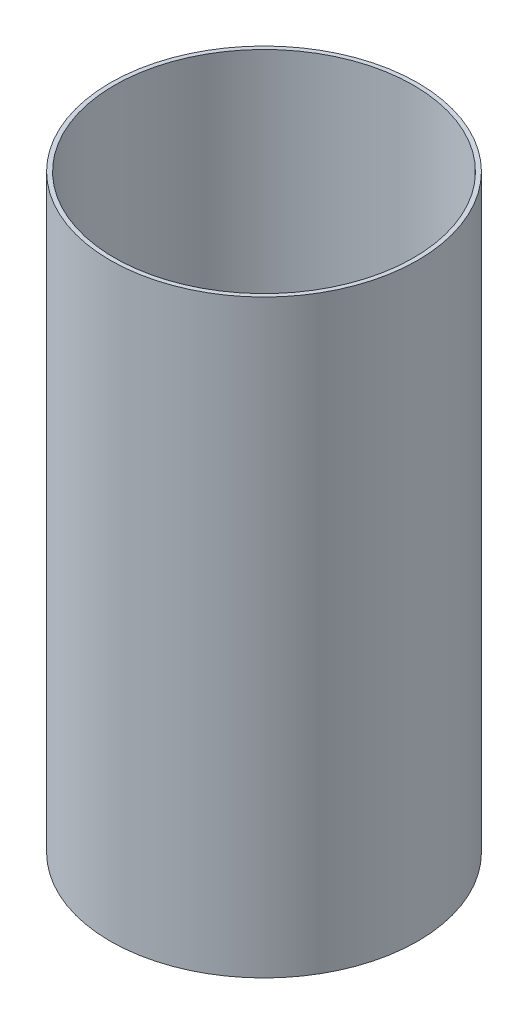
ISO-10303-21;
HEADER;
FILE_DESCRIPTION(('STEP AP214'),'2;1');
FILE_NAME('part.step','',(''),(''),'','','');
FILE_SCHEMA(('AUTOMOTIVE_DESIGN { 1 0 10303 214 1 1 1 1 }'));
ENDSEC;
DATA;
#1=APPLICATION_CONTEXT('core data for automotive mechanical design processes');
#2=APPLICATION_PROTOCOL_DEFINITION('international standard','automotive_design',2000,#1);
#3=PRODUCT_CONTEXT('',#1,'mechanical');
#4=PRODUCT('Part','Part','',(#3));
#5=PRODUCT_RELATED_PRODUCT_CATEGORY('part','',(#4));
#6=PRODUCT_DEFINITION_FORMATION('','',#4);
#7=PRODUCT_DEFINITION_CONTEXT('part definition',#1,'design');
#8=PRODUCT_DEFINITION('design','',#6,#7);
#9=PRODUCT_DEFINITION_SHAPE('','',#8);
#10=(LENGTH_UNIT() NAMED_UNIT(*) SI_UNIT(.MILLI.,.METRE.));
#11=(NAMED_UNIT(*) PLANE_ANGLE_UNIT() SI_UNIT($,.RADIAN.));
#12=(NAMED_UNIT(*) SI_UNIT($,.STERADIAN.) SOLID_ANGLE_UNIT());
#13=UNCERTAINTY_MEASURE_WITH_UNIT(LENGTH_MEASURE(1.E-05),#10,'distance_accuracy_value','');
#14=(GEOMETRIC_REPRESENTATION_CONTEXT(3) GLOBAL_UNCERTAINTY_ASSIGNED_CONTEXT((#13)) GLOBAL_UNIT_ASSIGNED_CONTEXT((#10,
#11,#12)) REPRESENTATION_CONTEXT('',''));
#15=CARTESIAN_POINT('',(0.,0.,0.));
#16=DIRECTION('',(0.,0.,1.));
#17=DIRECTION('',(1.,0.,0.));
#18=AXIS2_PLACEMENT_3D('',#15,#16,#17);
#19=CARTESIAN_POINT('',(-73.,-4.44089209850063E-13,0.));
#20=DIRECTION('',(0.,1.,0.));
#21=DIRECTION('',(0.,0.,1.));
#22=AXIS2_PLACEMENT_3D('',#19,#20,#21);
#23=PLANE('',#22);
#24=CARTESIAN_POINT('',(0.,-4.44089209850063E-13,0.));
#25=DIRECTION('',(0.,-1.,0.));
#26=DIRECTION('',(0.,0.,-1.));
#27=AXIS2_PLACEMENT_3D('',#24,#25,#26);
#28=CIRCLE('',#27,72.);
#29=CARTESIAN_POINT('',(0.,-4.44089209850063E-13,-72.));
#30=VERTEX_POINT('',#29);
#31=EDGE_CURVE('E10',#30,#30,#28,.T.);
#32=ORIENTED_EDGE('',*,*,#31,.F.);
#33=EDGE_LOOP('',(#32));
#34=FACE_BOUND('',#33,.T.);
#35=CARTESIAN_POINT('',(0.,-4.44089209850063E-13,0.));
#36=DIRECTION('',(0.,-1.,0.));
#37=DIRECTION('',(0.,0.,-1.));
#38=AXIS2_PLACEMENT_3D('',#35,#36,#37);
#39=CIRCLE('',#38,73.);
#40=CARTESIAN_POINT('',(0.,-4.44089209850063E-13,-73.));
#41=VERTEX_POINT('',#40);
#42=EDGE_CURVE('E57',#41,#41,#39,.T.);
#43=ORIENTED_EDGE('',*,*,#42,.T.);
#44=EDGE_LOOP('',(#43));
#45=FACE_BOUND('',#44,.T.);
#46=ADVANCED_FACE('F35',(#34,#45),#23,.F.);
#47=CARTESIAN_POINT('',(0.,0.,0.));
#48=DIRECTION('',(0.,-1.,0.));
#49=DIRECTION('',(0.,0.,-1.));
#50=AXIS2_PLACEMENT_3D('',#47,#48,#49);
#51=CYLINDRICAL_SURFACE('',#50,72.);
#52=CARTESIAN_POINT('',(0.,2.99999999999996,0.));
#53=DIRECTION('',(0.,-1.,0.));
#54=DIRECTION('',(0.,0.,-1.));
#55=AXIS2_PLACEMENT_3D('',#52,#53,#54);
#56=CIRCLE('',#55,72.);
#57=CARTESIAN_POINT('',(0.,2.99999999999996,-72.));
#58=VERTEX_POINT('',#57);
#59=EDGE_CURVE('E41',#58,#58,#56,.T.);
#60=ORIENTED_EDGE('',*,*,#59,.F.);
#61=EDGE_LOOP('',(#60));
#62=FACE_BOUND('',#61,.T.);
#63=ORIENTED_EDGE('',*,*,#31,.T.);
#64=EDGE_LOOP('',(#63));
#65=FACE_BOUND('',#64,.T.);
#66=ADVANCED_FACE('F82',(#62,#65),#51,.F.);
#67=CARTESIAN_POINT('',(-72.,2.99999999999976,0.));
#68=DIRECTION('',(0.,1.,0.));
#69=DIRECTION('',(0.,0.,1.));
#70=AXIS2_PLACEMENT_3D('',#67,#68,#69);
#71=PLANE('',#70);
#72=CARTESIAN_POINT('',(0.,2.99999999999956,0.));
#73=DIRECTION('',(0.,-1.,0.));
#74=DIRECTION('',(0.,0.,-1.));
#75=AXIS2_PLACEMENT_3D('',#72,#73,#74);
#76=CIRCLE('',#75,71.);
#77=CARTESIAN_POINT('',(0.,2.99999999999956,-71.));
#78=VERTEX_POINT('',#77);
#79=EDGE_CURVE('E45',#78,#78,#76,.T.);
#80=ORIENTED_EDGE('',*,*,#79,.F.);
#81=EDGE_LOOP('',(#80));
#82=FACE_BOUND('',#81,.T.);
#83=ORIENTED_EDGE('',*,*,#59,.T.);
#84=EDGE_LOOP('',(#83));
#85=FACE_BOUND('',#84,.T.);
#86=ADVANCED_FACE('F77',(#82,#85),#71,.F.);
#87=CARTESIAN_POINT('',(0.,0.,0.));
#88=DIRECTION('',(0.,-1.,0.));
#89=DIRECTION('',(0.,0.,-1.));
#90=AXIS2_PLACEMENT_3D('',#87,#88,#89);
#91=CYLINDRICAL_SURFACE('',#90,71.);
#92=CARTESIAN_POINT('',(0.,280.,0.));
#93=DIRECTION('',(0.,-1.,0.));
#94=DIRECTION('',(0.,0.,-1.));
#95=AXIS2_PLACEMENT_3D('',#92,#93,#94);
#96=CIRCLE('',#95,71.);
#97=CARTESIAN_POINT('',(0.,280.,-71.));
#98=VERTEX_POINT('',#97);
#99=EDGE_CURVE('E49',#98,#98,#96,.T.);
#100=ORIENTED_EDGE('',*,*,#99,.F.);
#101=EDGE_LOOP('',(#100));
#102=FACE_BOUND('',#101,.T.);
#103=ORIENTED_EDGE('',*,*,#79,.T.);
#104=EDGE_LOOP('',(#103));
#105=FACE_BOUND('',#104,.T.);
#106=ADVANCED_FACE('F71',(#102,#105),#91,.F.);
#107=CARTESIAN_POINT('',(-71.,280.,0.));
#108=DIRECTION('',(0.,-1.,0.));
#109=DIRECTION('',(0.,0.,-1.));
#110=AXIS2_PLACEMENT_3D('',#107,#108,#109);
#111=PLANE('',#110);
#112=CARTESIAN_POINT('',(0.,280.,0.));
#113=DIRECTION('',(0.,-1.,0.));
#114=DIRECTION('',(0.,0.,-1.));
#115=AXIS2_PLACEMENT_3D('',#112,#113,#114);
#116=CIRCLE('',#115,73.0000000000001);
#117=CARTESIAN_POINT('',(0.,280.,-73.0000000000001));
#118=VERTEX_POINT('',#117);
#119=EDGE_CURVE('E54',#118,#118,#116,.T.);
#120=ORIENTED_EDGE('',*,*,#119,.F.);
#121=EDGE_LOOP('',(#120));
#122=FACE_BOUND('',#121,.T.);
#123=ORIENTED_EDGE('',*,*,#99,.T.);
#124=EDGE_LOOP('',(#123));
#125=FACE_BOUND('',#124,.T.);
#126=ADVANCED_FACE('F65',(#122,#125),#111,.F.);
#127=CARTESIAN_POINT('',(0.,0.,0.));
#128=DIRECTION('',(0.,-1.,0.));
#129=DIRECTION('',(0.,0.,-1.));
#130=AXIS2_PLACEMENT_3D('',#127,#128,#129);
#131=CYLINDRICAL_SURFACE('',#130,73.);
#132=ORIENTED_EDGE('',*,*,#42,.F.);
#133=EDGE_LOOP('',(#132));
#134=FACE_BOUND('',#133,.T.);
#135=ORIENTED_EDGE('',*,*,#119,.T.);
#136=EDGE_LOOP('',(#135));
#137=FACE_BOUND('',#136,.T.);
#138=ADVANCED_FACE('F62',(#134,#137),#131,.T.);
#139=CLOSED_SHELL('',(#46,#66,#86,#106,#126,#138));
#140=MANIFOLD_SOLID_BREP('B2',#139);
#141=ADVANCED_BREP_SHAPE_REPRESENTATION('',(#18,#140),#14);
#142=SHAPE_DEFINITION_REPRESENTATION(#9,#141);
ENDSEC;
END-ISO-10303-21;
